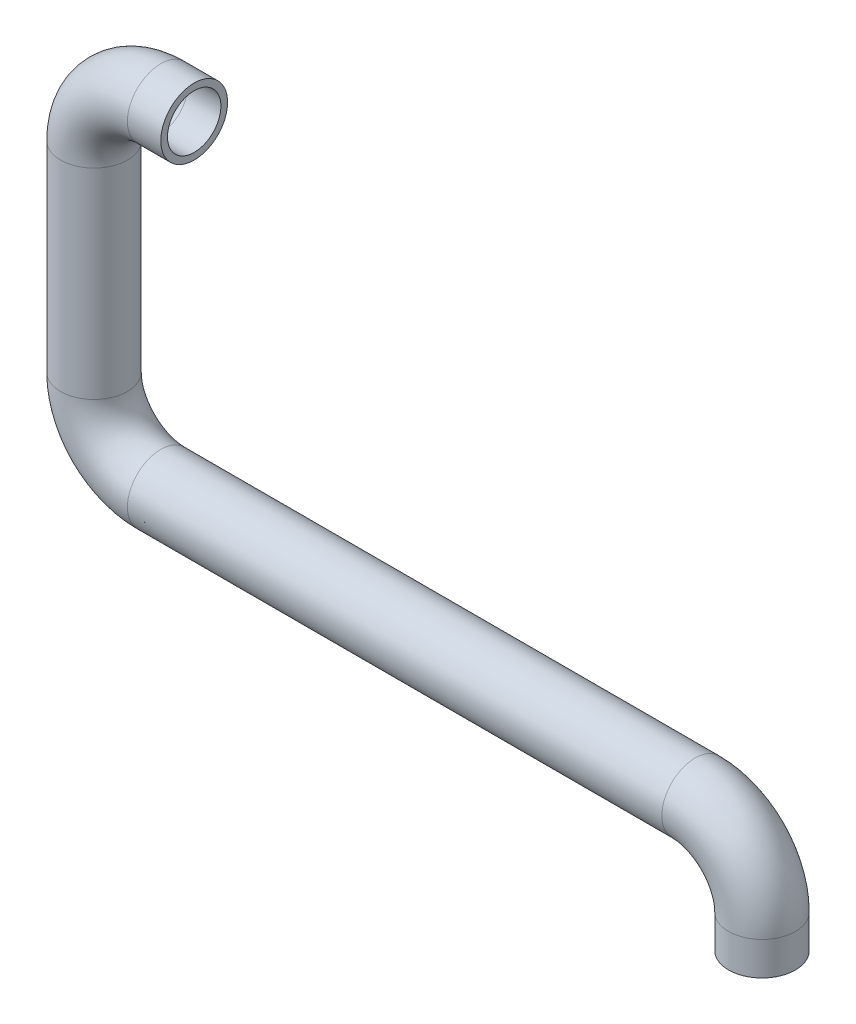
ISO-10303-21;
HEADER;
FILE_DESCRIPTION(('STEP AP214'),'2;1');
FILE_NAME('part.step','',(''),(''),'','','');
FILE_SCHEMA(('AUTOMOTIVE_DESIGN { 1 0 10303 214 1 1 1 1 }'));
ENDSEC;
DATA;
#1=APPLICATION_CONTEXT('core data for automotive mechanical design processes');
#2=APPLICATION_PROTOCOL_DEFINITION('international standard','automotive_design',2000,#1);
#3=PRODUCT_CONTEXT('',#1,'mechanical');
#4=PRODUCT('Part','Part','',(#3));
#5=PRODUCT_RELATED_PRODUCT_CATEGORY('part','',(#4));
#6=PRODUCT_DEFINITION_FORMATION('','',#4);
#7=PRODUCT_DEFINITION_CONTEXT('part definition',#1,'design');
#8=PRODUCT_DEFINITION('design','',#6,#7);
#9=PRODUCT_DEFINITION_SHAPE('','',#8);
#10=(LENGTH_UNIT() NAMED_UNIT(*) SI_UNIT(.MILLI.,.METRE.));
#11=(NAMED_UNIT(*) PLANE_ANGLE_UNIT() SI_UNIT($,.RADIAN.));
#12=(NAMED_UNIT(*) SI_UNIT($,.STERADIAN.) SOLID_ANGLE_UNIT());
#13=UNCERTAINTY_MEASURE_WITH_UNIT(LENGTH_MEASURE(1.E-05),#10,'distance_accuracy_value','');
#14=(GEOMETRIC_REPRESENTATION_CONTEXT(3) GLOBAL_UNCERTAINTY_ASSIGNED_CONTEXT((#13)) GLOBAL_UNIT_ASSIGNED_CONTEXT((#10,
#11,#12)) REPRESENTATION_CONTEXT('',''));
#15=CARTESIAN_POINT('',(0.,0.,0.));
#16=DIRECTION('',(0.,0.,1.));
#17=DIRECTION('',(1.,0.,0.));
#18=AXIS2_PLACEMENT_3D('',#15,#16,#17);
#19=CARTESIAN_POINT('',(-85.,50.,0.));
#20=DIRECTION('',(1.,0.,0.));
#21=DIRECTION('',(0.,1.,0.));
#22=AXIS2_PLACEMENT_3D('',#19,#20,#21);
#23=PLANE('',#22);
#24=CARTESIAN_POINT('',(-85.,50.,0.));
#25=DIRECTION('',(1.,0.,0.));
#26=DIRECTION('',(0.,1.,0.));
#27=AXIS2_PLACEMENT_3D('',#24,#25,#26);
#28=CIRCLE('',#27,4.);
#29=CARTESIAN_POINT('',(-85.,54.,0.));
#30=VERTEX_POINT('',#29);
#31=EDGE_CURVE('E86',#30,#30,#28,.T.);
#32=ORIENTED_EDGE('',*,*,#31,.F.);
#33=EDGE_LOOP('',(#32));
#34=FACE_BOUND('',#33,.T.);
#35=CARTESIAN_POINT('',(-85.,50.,0.));
#36=DIRECTION('',(1.,0.,0.));
#37=DIRECTION('',(0.,1.,0.));
#38=AXIS2_PLACEMENT_3D('',#35,#36,#37);
#39=CIRCLE('',#38,5.);
#40=CARTESIAN_POINT('',(-85.,55.,0.));
#41=VERTEX_POINT('',#40);
#42=EDGE_CURVE('E79',#41,#41,#39,.T.);
#43=ORIENTED_EDGE('',*,*,#42,.T.);
#44=EDGE_LOOP('',(#43));
#45=FACE_BOUND('',#44,.T.);
#46=ADVANCED_FACE('F51',(#34,#45),#23,.T.);
#47=CARTESIAN_POINT('',(0.,-15.,0.));
#48=DIRECTION('',(0.,1.,0.));
#49=DIRECTION('',(-1.,0.,0.));
#50=AXIS2_PLACEMENT_3D('',#47,#48,#49);
#51=PLANE('',#50);
#52=CARTESIAN_POINT('',(0.,-15.,0.));
#53=DIRECTION('',(0.,1.,0.));
#54=DIRECTION('',(-1.,0.,0.));
#55=AXIS2_PLACEMENT_3D('',#52,#53,#54);
#56=CIRCLE('',#55,4.);
#57=CARTESIAN_POINT('',(-4.,-15.,0.));
#58=VERTEX_POINT('',#57);
#59=EDGE_CURVE('E82',#58,#58,#56,.T.);
#60=ORIENTED_EDGE('',*,*,#59,.T.);
#61=EDGE_LOOP('',(#60));
#62=FACE_BOUND('',#61,.T.);
#63=CARTESIAN_POINT('',(0.,-15.,0.));
#64=DIRECTION('',(0.,1.,0.));
#65=DIRECTION('',(-1.,0.,0.));
#66=AXIS2_PLACEMENT_3D('',#63,#64,#65);
#67=CIRCLE('',#66,5.);
#68=CARTESIAN_POINT('',(-5.,-15.,0.));
#69=VERTEX_POINT('',#68);
#70=EDGE_CURVE('E11',#69,#69,#67,.T.);
#71=ORIENTED_EDGE('',*,*,#70,.F.);
#72=EDGE_LOOP('',(#71));
#73=FACE_BOUND('',#72,.T.);
#74=ADVANCED_FACE('F118',(#62,#73),#51,.F.);
#75=CARTESIAN_POINT('',(-85.,50.,0.));
#76=DIRECTION('',(-1.,0.,0.));
#77=DIRECTION('',(0.,-1.,0.));
#78=AXIS2_PLACEMENT_3D('',#75,#76,#77);
#79=CYLINDRICAL_SURFACE('',#78,5.);
#80=CARTESIAN_POINT('',(-90.,50.,0.));
#81=DIRECTION('',(1.,0.,0.));
#82=DIRECTION('',(0.,1.,0.));
#83=AXIS2_PLACEMENT_3D('',#80,#81,#82);
#84=CIRCLE('',#83,5.);
#85=CARTESIAN_POINT('',(-90.,55.,0.));
#86=VERTEX_POINT('',#85);
#87=EDGE_CURVE('E76',#86,#86,#84,.T.);
#88=ORIENTED_EDGE('',*,*,#87,.T.);
#89=EDGE_LOOP('',(#88));
#90=FACE_BOUND('',#89,.T.);
#91=ORIENTED_EDGE('',*,*,#42,.F.);
#92=EDGE_LOOP('',(#91));
#93=FACE_BOUND('',#92,.T.);
#94=ADVANCED_FACE('F122',(#90,#93),#79,.T.);
#95=CARTESIAN_POINT('',(-90.,40.,0.));
#96=DIRECTION('',(0.,0.,1.));
#97=DIRECTION('',(1.,0.,0.));
#98=AXIS2_PLACEMENT_3D('',#95,#96,#97);
#99=TOROIDAL_SURFACE('',#98,10.,5.);
#100=CARTESIAN_POINT('',(-100.,40.,0.));
#101=DIRECTION('',(0.,1.,0.));
#102=DIRECTION('',(-1.,0.,0.));
#103=AXIS2_PLACEMENT_3D('',#100,#101,#102);
#104=CIRCLE('',#103,5.);
#105=CARTESIAN_POINT('',(-105.,40.,0.));
#106=VERTEX_POINT('',#105);
#107=EDGE_CURVE('E73',#106,#106,#104,.T.);
#108=CARTESIAN_POINT('',(-90.,40.,0.));
#109=DIRECTION('',(0.,0.,1.));
#110=DIRECTION('',(1.,0.,0.));
#111=AXIS2_PLACEMENT_3D('',#108,#109,#110);
#112=CIRCLE('',#111,15.);
#113=EDGE_CURVE('',#86,#106,#112,.T.);
#114=ORIENTED_EDGE('',*,*,#87,.F.);
#115=ORIENTED_EDGE('',*,*,#107,.T.);
#116=ORIENTED_EDGE('',*,*,#113,.T.);
#117=ORIENTED_EDGE('',*,*,#113,.F.);
#118=EDGE_LOOP('',(#114,#116,#115,#117));
#119=FACE_BOUND('',#118,.T.);
#120=ADVANCED_FACE('F124',(#119),#99,.T.);
#121=CARTESIAN_POINT('',(-100.,40.,0.));
#122=DIRECTION('',(0.,-1.,0.));
#123=DIRECTION('',(0.,0.,-1.));
#124=AXIS2_PLACEMENT_3D('',#121,#122,#123);
#125=CYLINDRICAL_SURFACE('',#124,5.);
#126=CARTESIAN_POINT('',(-100.,9.99999999999999,0.));
#127=DIRECTION('',(0.,1.,0.));
#128=DIRECTION('',(-1.,0.,0.));
#129=AXIS2_PLACEMENT_3D('',#126,#127,#128);
#130=CIRCLE('',#129,5.);
#131=CARTESIAN_POINT('',(-105.,9.99999999999999,0.));
#132=VERTEX_POINT('',#131);
#133=EDGE_CURVE('E70',#132,#132,#130,.T.);
#134=ORIENTED_EDGE('',*,*,#133,.T.);
#135=EDGE_LOOP('',(#134));
#136=FACE_BOUND('',#135,.T.);
#137=ORIENTED_EDGE('',*,*,#107,.F.);
#138=EDGE_LOOP('',(#137));
#139=FACE_BOUND('',#138,.T.);
#140=ADVANCED_FACE('F131',(#136,#139),#125,.T.);
#141=CARTESIAN_POINT('',(-90.,9.99999999999999,0.));
#142=DIRECTION('',(0.,0.,1.));
#143=DIRECTION('',(1.,0.,0.));
#144=AXIS2_PLACEMENT_3D('',#141,#142,#143);
#145=TOROIDAL_SURFACE('',#144,9.99999999999999,5.);
#146=CARTESIAN_POINT('',(-90.,0.,0.));
#147=DIRECTION('',(-1.,0.,0.));
#148=DIRECTION('',(0.,-1.,0.));
#149=AXIS2_PLACEMENT_3D('',#146,#147,#148);
#150=CIRCLE('',#149,5.);
#151=CARTESIAN_POINT('',(-90.,-5.00000000000001,0.));
#152=VERTEX_POINT('',#151);
#153=EDGE_CURVE('E65',#152,#152,#150,.T.);
#154=CARTESIAN_POINT('',(-90.,9.99999999999999,0.));
#155=DIRECTION('',(0.,0.,1.));
#156=DIRECTION('',(1.,0.,0.));
#157=AXIS2_PLACEMENT_3D('',#154,#155,#156);
#158=CIRCLE('',#157,15.);
#159=EDGE_CURVE('',#132,#152,#158,.T.);
#160=ORIENTED_EDGE('',*,*,#133,.F.);
#161=ORIENTED_EDGE('',*,*,#153,.T.);
#162=ORIENTED_EDGE('',*,*,#159,.T.);
#163=ORIENTED_EDGE('',*,*,#159,.F.);
#164=EDGE_LOOP('',(#160,#162,#161,#163));
#165=FACE_BOUND('',#164,.T.);
#166=ADVANCED_FACE('F148',(#165),#145,.T.);
#167=CARTESIAN_POINT('',(-90.,0.,0.));
#168=DIRECTION('',(1.,0.,0.));
#169=DIRECTION('',(0.,1.,0.));
#170=AXIS2_PLACEMENT_3D('',#167,#168,#169);
#171=CYLINDRICAL_SURFACE('',#170,5.);
#172=CARTESIAN_POINT('',(-10.0000000000001,0.,0.));
#173=DIRECTION('',(-1.,0.,0.));
#174=DIRECTION('',(0.,-1.,0.));
#175=AXIS2_PLACEMENT_3D('',#172,#173,#174);
#176=CIRCLE('',#175,5.);
#177=CARTESIAN_POINT('',(-10.0000000000001,5.,0.));
#178=VERTEX_POINT('',#177);
#179=EDGE_CURVE('E61',#178,#178,#176,.T.);
#180=ORIENTED_EDGE('',*,*,#179,.T.);
#181=EDGE_LOOP('',(#180));
#182=FACE_BOUND('',#181,.T.);
#183=ORIENTED_EDGE('',*,*,#153,.F.);
#184=EDGE_LOOP('',(#183));
#185=FACE_BOUND('',#184,.T.);
#186=ADVANCED_FACE('F142',(#182,#185),#171,.T.);
#187=CARTESIAN_POINT('',(-10.,-10.,0.));
#188=DIRECTION('',(0.,0.,-1.));
#189=DIRECTION('',(-1.,0.,0.));
#190=AXIS2_PLACEMENT_3D('',#187,#188,#189);
#191=TOROIDAL_SURFACE('',#190,10.,5.);
#192=CARTESIAN_POINT('',(1.02450931805376E-13,-10.0000000000001,0.));
#193=DIRECTION('',(0.,1.,0.));
#194=DIRECTION('',(-1.,0.,0.));
#195=AXIS2_PLACEMENT_3D('',#192,#193,#194);
#196=CIRCLE('',#195,5.);
#197=CARTESIAN_POINT('',(5.,-10.0000000000001,0.));
#198=VERTEX_POINT('',#197);
#199=EDGE_CURVE('E57',#198,#198,#196,.T.);
#200=CARTESIAN_POINT('',(-10.,-10.,0.));
#201=DIRECTION('',(0.,0.,-1.));
#202=DIRECTION('',(-1.,0.,0.));
#203=AXIS2_PLACEMENT_3D('',#200,#201,#202);
#204=CIRCLE('',#203,15.);
#205=EDGE_CURVE('',#178,#198,#204,.T.);
#206=ORIENTED_EDGE('',*,*,#179,.F.);
#207=ORIENTED_EDGE('',*,*,#199,.T.);
#208=ORIENTED_EDGE('',*,*,#205,.T.);
#209=ORIENTED_EDGE('',*,*,#205,.F.);
#210=EDGE_LOOP('',(#206,#208,#207,#209));
#211=FACE_BOUND('',#210,.T.);
#212=ADVANCED_FACE('F137',(#211),#191,.T.);
#213=CARTESIAN_POINT('',(0.,-10.0000000000001,0.));
#214=DIRECTION('',(0.,-1.,0.));
#215=DIRECTION('',(1.,0.,0.));
#216=AXIS2_PLACEMENT_3D('',#213,#214,#215);
#217=CYLINDRICAL_SURFACE('',#216,5.);
#218=ORIENTED_EDGE('',*,*,#70,.T.);
#219=EDGE_LOOP('',(#218));
#220=FACE_BOUND('',#219,.T.);
#221=ORIENTED_EDGE('',*,*,#199,.F.);
#222=EDGE_LOOP('',(#221));
#223=FACE_BOUND('',#222,.T.);
#224=ADVANCED_FACE('F112',(#220,#223),#217,.T.);
#225=CARTESIAN_POINT('',(-85.,50.,0.));
#226=DIRECTION('',(-1.,0.,0.));
#227=DIRECTION('',(0.,-1.,0.));
#228=AXIS2_PLACEMENT_3D('',#225,#226,#227);
#229=CYLINDRICAL_SURFACE('',#228,4.);
#230=CARTESIAN_POINT('',(-90.,50.,0.));
#231=DIRECTION('',(-1.,0.,0.));
#232=DIRECTION('',(0.,-1.,0.));
#233=AXIS2_PLACEMENT_3D('',#230,#231,#232);
#234=CIRCLE('',#233,4.);
#235=CARTESIAN_POINT('',(-90.,54.,0.));
#236=VERTEX_POINT('',#235);
#237=EDGE_CURVE('E89',#236,#236,#234,.F.);
#238=ORIENTED_EDGE('',*,*,#237,.F.);
#239=EDGE_LOOP('',(#238));
#240=FACE_BOUND('',#239,.T.);
#241=ORIENTED_EDGE('',*,*,#31,.T.);
#242=EDGE_LOOP('',(#241));
#243=FACE_BOUND('',#242,.T.);
#244=ADVANCED_FACE('F109',(#240,#243),#229,.F.);
#245=CARTESIAN_POINT('',(-90.,40.,0.));
#246=DIRECTION('',(0.,0.,1.));
#247=DIRECTION('',(1.,0.,0.));
#248=AXIS2_PLACEMENT_3D('',#245,#246,#247);
#249=TOROIDAL_SURFACE('',#248,10.,4.);
#250=CARTESIAN_POINT('',(-100.,40.,0.));
#251=DIRECTION('',(0.,1.,0.));
#252=DIRECTION('',(-1.,0.,0.));
#253=AXIS2_PLACEMENT_3D('',#250,#251,#252);
#254=CIRCLE('',#253,4.);
#255=CARTESIAN_POINT('',(-104.,40.,0.));
#256=VERTEX_POINT('',#255);
#257=EDGE_CURVE('E101',#256,#256,#254,.T.);
#258=CARTESIAN_POINT('',(-90.,40.,0.));
#259=DIRECTION('',(0.,0.,1.));
#260=DIRECTION('',(1.,0.,0.));
#261=AXIS2_PLACEMENT_3D('',#258,#259,#260);
#262=CIRCLE('',#261,14.);
#263=EDGE_CURVE('',#236,#256,#262,.T.);
#264=ORIENTED_EDGE('',*,*,#237,.T.);
#265=ORIENTED_EDGE('',*,*,#257,.F.);
#266=ORIENTED_EDGE('',*,*,#263,.T.);
#267=ORIENTED_EDGE('',*,*,#263,.F.);
#268=EDGE_LOOP('',(#264,#266,#265,#267));
#269=FACE_BOUND('',#268,.T.);
#270=ADVANCED_FACE('F107',(#269),#249,.F.);
#271=CARTESIAN_POINT('',(-100.,40.,0.));
#272=DIRECTION('',(0.,-1.,0.));
#273=DIRECTION('',(0.,0.,-1.));
#274=AXIS2_PLACEMENT_3D('',#271,#272,#273);
#275=CYLINDRICAL_SURFACE('',#274,4.);
#276=CARTESIAN_POINT('',(-100.,9.99999999999999,0.));
#277=DIRECTION('',(0.,-1.,0.));
#278=DIRECTION('',(0.,0.,-1.));
#279=AXIS2_PLACEMENT_3D('',#276,#277,#278);
#280=CIRCLE('',#279,4.);
#281=CARTESIAN_POINT('',(-104.,9.99999999999999,0.));
#282=VERTEX_POINT('',#281);
#283=EDGE_CURVE('E98',#282,#282,#280,.F.);
#284=ORIENTED_EDGE('',*,*,#283,.F.);
#285=EDGE_LOOP('',(#284));
#286=FACE_BOUND('',#285,.T.);
#287=ORIENTED_EDGE('',*,*,#257,.T.);
#288=EDGE_LOOP('',(#287));
#289=FACE_BOUND('',#288,.T.);
#290=ADVANCED_FACE('F196',(#286,#289),#275,.F.);
#291=CARTESIAN_POINT('',(-90.,9.99999999999999,0.));
#292=DIRECTION('',(0.,0.,1.));
#293=DIRECTION('',(1.,0.,0.));
#294=AXIS2_PLACEMENT_3D('',#291,#292,#293);
#295=TOROIDAL_SURFACE('',#294,9.99999999999999,4.);
#296=CARTESIAN_POINT('',(-90.,0.,0.));
#297=DIRECTION('',(-1.,0.,0.));
#298=DIRECTION('',(0.,-1.,0.));
#299=AXIS2_PLACEMENT_3D('',#296,#297,#298);
#300=CIRCLE('',#299,4.);
#301=CARTESIAN_POINT('',(-90.,-4.00000000000001,0.));
#302=VERTEX_POINT('',#301);
#303=EDGE_CURVE('E95',#302,#302,#300,.T.);
#304=CARTESIAN_POINT('',(-90.,9.99999999999999,0.));
#305=DIRECTION('',(0.,0.,1.));
#306=DIRECTION('',(1.,0.,0.));
#307=AXIS2_PLACEMENT_3D('',#304,#305,#306);
#308=CIRCLE('',#307,14.);
#309=EDGE_CURVE('',#282,#302,#308,.T.);
#310=ORIENTED_EDGE('',*,*,#283,.T.);
#311=ORIENTED_EDGE('',*,*,#303,.F.);
#312=ORIENTED_EDGE('',*,*,#309,.T.);
#313=ORIENTED_EDGE('',*,*,#309,.F.);
#314=EDGE_LOOP('',(#310,#312,#311,#313));
#315=FACE_BOUND('',#314,.T.);
#316=ADVANCED_FACE('F206',(#315),#295,.F.);
#317=CARTESIAN_POINT('',(-90.,0.,0.));
#318=DIRECTION('',(1.,0.,0.));
#319=DIRECTION('',(0.,1.,0.));
#320=AXIS2_PLACEMENT_3D('',#317,#318,#319);
#321=CYLINDRICAL_SURFACE('',#320,4.);
#322=CARTESIAN_POINT('',(-10.0000000000001,0.,0.));
#323=DIRECTION('',(1.,0.,0.));
#324=DIRECTION('',(0.,1.,0.));
#325=AXIS2_PLACEMENT_3D('',#322,#323,#324);
#326=CIRCLE('',#325,4.);
#327=CARTESIAN_POINT('',(-10.0000000000001,4.,0.));
#328=VERTEX_POINT('',#327);
#329=EDGE_CURVE('E92',#328,#328,#326,.F.);
#330=ORIENTED_EDGE('',*,*,#329,.F.);
#331=EDGE_LOOP('',(#330));
#332=FACE_BOUND('',#331,.T.);
#333=ORIENTED_EDGE('',*,*,#303,.T.);
#334=EDGE_LOOP('',(#333));
#335=FACE_BOUND('',#334,.T.);
#336=ADVANCED_FACE('F216',(#332,#335),#321,.F.);
#337=CARTESIAN_POINT('',(-10.,-10.,0.));
#338=DIRECTION('',(0.,0.,-1.));
#339=DIRECTION('',(-1.,0.,0.));
#340=AXIS2_PLACEMENT_3D('',#337,#338,#339);
#341=TOROIDAL_SURFACE('',#340,10.,4.);
#342=CARTESIAN_POINT('',(0.,-10.,0.));
#343=DIRECTION('',(0.,1.,0.));
#344=DIRECTION('',(-1.,0.,0.));
#345=AXIS2_PLACEMENT_3D('',#342,#343,#344);
#346=CIRCLE('',#345,4.);
#347=CARTESIAN_POINT('',(4.,-10.0000000000001,0.));
#348=VERTEX_POINT('',#347);
#349=EDGE_CURVE('E85',#348,#348,#346,.T.);
#350=CARTESIAN_POINT('',(-10.,-10.,0.));
#351=DIRECTION('',(0.,0.,-1.));
#352=DIRECTION('',(-1.,0.,0.));
#353=AXIS2_PLACEMENT_3D('',#350,#351,#352);
#354=CIRCLE('',#353,14.);
#355=EDGE_CURVE('',#328,#348,#354,.T.);
#356=ORIENTED_EDGE('',*,*,#329,.T.);
#357=ORIENTED_EDGE('',*,*,#349,.F.);
#358=ORIENTED_EDGE('',*,*,#355,.T.);
#359=ORIENTED_EDGE('',*,*,#355,.F.);
#360=EDGE_LOOP('',(#356,#358,#357,#359));
#361=FACE_BOUND('',#360,.T.);
#362=ADVANCED_FACE('F226',(#361),#341,.F.);
#363=CARTESIAN_POINT('',(0.,-10.0000000000001,0.));
#364=DIRECTION('',(0.,-1.,0.));
#365=DIRECTION('',(1.,0.,0.));
#366=AXIS2_PLACEMENT_3D('',#363,#364,#365);
#367=CYLINDRICAL_SURFACE('',#366,4.);
#368=ORIENTED_EDGE('',*,*,#59,.F.);
#369=EDGE_LOOP('',(#368));
#370=FACE_BOUND('',#369,.T.);
#371=ORIENTED_EDGE('',*,*,#349,.T.);
#372=EDGE_LOOP('',(#371));
#373=FACE_BOUND('',#372,.T.);
#374=ADVANCED_FACE('F119',(#370,#373),#367,.F.);
#375=CLOSED_SHELL('',(#46,#74,#94,#120,#140,#166,#186,#212,#224,#244,#270,#290,#316,#336,#362,#374));
#376=MANIFOLD_SOLID_BREP('B2',#375);
#377=ADVANCED_BREP_SHAPE_REPRESENTATION('',(#18,#376),#14);
#378=SHAPE_DEFINITION_REPRESENTATION(#9,#377);
ENDSEC;
END-ISO-10303-21;
